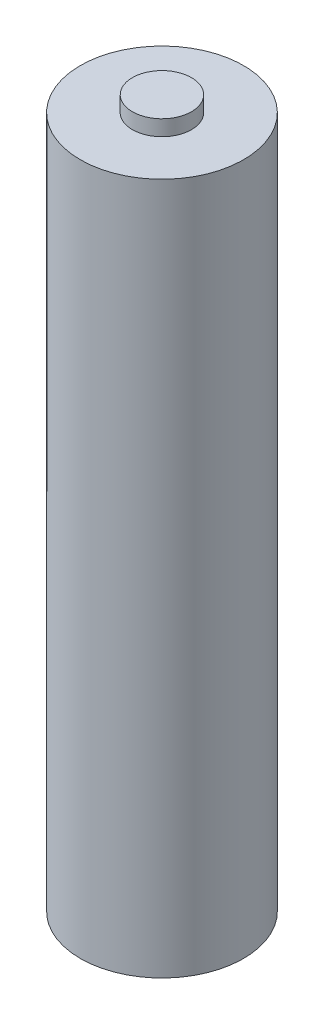
ISO-10303-21;
HEADER;
FILE_DESCRIPTION(('STEP AP214'),'2;1');
FILE_NAME('part.step','',(''),(''),'','','');
FILE_SCHEMA(('AUTOMOTIVE_DESIGN { 1 0 10303 214 1 1 1 1 }'));
ENDSEC;
DATA;
#1=APPLICATION_CONTEXT('core data for automotive mechanical design processes');
#2=APPLICATION_PROTOCOL_DEFINITION('international standard','automotive_design',2000,#1);
#3=PRODUCT_CONTEXT('',#1,'mechanical');
#4=PRODUCT('Part','Part','',(#3));
#5=PRODUCT_RELATED_PRODUCT_CATEGORY('part','',(#4));
#6=PRODUCT_DEFINITION_FORMATION('','',#4);
#7=PRODUCT_DEFINITION_CONTEXT('part definition',#1,'design');
#8=PRODUCT_DEFINITION('design','',#6,#7);
#9=PRODUCT_DEFINITION_SHAPE('','',#8);
#10=(LENGTH_UNIT() NAMED_UNIT(*) SI_UNIT(.MILLI.,.METRE.));
#11=(NAMED_UNIT(*) PLANE_ANGLE_UNIT() SI_UNIT($,.RADIAN.));
#12=(NAMED_UNIT(*) SI_UNIT($,.STERADIAN.) SOLID_ANGLE_UNIT());
#13=UNCERTAINTY_MEASURE_WITH_UNIT(LENGTH_MEASURE(1.E-05),#10,'distance_accuracy_value','');
#14=(GEOMETRIC_REPRESENTATION_CONTEXT(3) GLOBAL_UNCERTAINTY_ASSIGNED_CONTEXT((#13)) GLOBAL_UNIT_ASSIGNED_CONTEXT((#10,
#11,#12)) REPRESENTATION_CONTEXT('',''));
#15=CARTESIAN_POINT('',(0.,0.,0.));
#16=DIRECTION('',(0.,0.,1.));
#17=DIRECTION('',(1.,0.,0.));
#18=AXIS2_PLACEMENT_3D('',#15,#16,#17);
#19=CARTESIAN_POINT('',(0.,44.5,0.));
#20=DIRECTION('',(0.,-1.,0.));
#21=DIRECTION('',(0.,0.,-1.));
#22=AXIS2_PLACEMENT_3D('',#19,#20,#21);
#23=CYLINDRICAL_SURFACE('',#22,5.25);
#24=CARTESIAN_POINT('',(0.,44.5,0.));
#25=DIRECTION('',(0.,1.,0.));
#26=DIRECTION('',(0.,0.,1.));
#27=AXIS2_PLACEMENT_3D('',#24,#25,#26);
#28=CIRCLE('',#27,5.25);
#29=CARTESIAN_POINT('',(0.,44.5,5.25));
#30=VERTEX_POINT('',#29);
#31=EDGE_CURVE('E41',#30,#30,#28,.T.);
#32=ORIENTED_EDGE('',*,*,#31,.F.);
#33=EDGE_LOOP('',(#32));
#34=FACE_BOUND('',#33,.T.);
#35=CARTESIAN_POINT('',(0.,0.,0.));
#36=DIRECTION('',(0.,1.,0.));
#37=DIRECTION('',(0.,0.,1.));
#38=AXIS2_PLACEMENT_3D('',#35,#36,#37);
#39=CIRCLE('',#38,5.25);
#40=CARTESIAN_POINT('',(0.,0.,5.25));
#41=VERTEX_POINT('',#40);
#42=EDGE_CURVE('E37',#41,#41,#39,.T.);
#43=ORIENTED_EDGE('',*,*,#42,.T.);
#44=EDGE_LOOP('',(#43));
#45=FACE_BOUND('',#44,.T.);
#46=ADVANCED_FACE('F34',(#34,#45),#23,.T.);
#47=CARTESIAN_POINT('',(0.,44.5,0.));
#48=DIRECTION('',(0.,1.,0.));
#49=DIRECTION('',(0.,0.,1.));
#50=AXIS2_PLACEMENT_3D('',#47,#48,#49);
#51=PLANE('',#50);
#52=CARTESIAN_POINT('',(0.,44.5,0.));
#53=DIRECTION('',(0.,1.,0.));
#54=DIRECTION('',(0.,0.,1.));
#55=AXIS2_PLACEMENT_3D('',#52,#53,#54);
#56=CIRCLE('',#55,1.9);
#57=CARTESIAN_POINT('',(0.,44.5,1.9));
#58=VERTEX_POINT('',#57);
#59=EDGE_CURVE('E10',#58,#58,#56,.T.);
#60=ORIENTED_EDGE('',*,*,#59,.F.);
#61=EDGE_LOOP('',(#60));
#62=FACE_BOUND('',#61,.T.);
#63=ORIENTED_EDGE('',*,*,#31,.T.);
#64=EDGE_LOOP('',(#63));
#65=FACE_BOUND('',#64,.T.);
#66=ADVANCED_FACE('F58',(#62,#65),#51,.T.);
#67=CARTESIAN_POINT('',(0.,0.,0.));
#68=DIRECTION('',(0.,1.,0.));
#69=DIRECTION('',(0.,0.,1.));
#70=AXIS2_PLACEMENT_3D('',#67,#68,#69);
#71=PLANE('',#70);
#72=ORIENTED_EDGE('',*,*,#42,.F.);
#73=EDGE_LOOP('',(#72));
#74=FACE_BOUND('',#73,.T.);
#75=ADVANCED_FACE('F55',(#74),#71,.F.);
#76=CARTESIAN_POINT('',(0.,45.5,0.));
#77=DIRECTION('',(0.,-1.,0.));
#78=DIRECTION('',(0.,0.,-1.));
#79=AXIS2_PLACEMENT_3D('',#76,#77,#78);
#80=CYLINDRICAL_SURFACE('',#79,1.9);
#81=CARTESIAN_POINT('',(0.,45.5,0.));
#82=DIRECTION('',(0.,1.,0.));
#83=DIRECTION('',(0.,0.,1.));
#84=AXIS2_PLACEMENT_3D('',#81,#82,#83);
#85=CIRCLE('',#84,1.9);
#86=CARTESIAN_POINT('',(0.,45.5,1.9));
#87=VERTEX_POINT('',#86);
#88=EDGE_CURVE('E47',#87,#87,#85,.T.);
#89=ORIENTED_EDGE('',*,*,#88,.F.);
#90=EDGE_LOOP('',(#89));
#91=FACE_BOUND('',#90,.T.);
#92=ORIENTED_EDGE('',*,*,#59,.T.);
#93=EDGE_LOOP('',(#92));
#94=FACE_BOUND('',#93,.T.);
#95=ADVANCED_FACE('F57',(#91,#94),#80,.T.);
#96=CARTESIAN_POINT('',(0.,45.5,0.));
#97=DIRECTION('',(0.,1.,0.));
#98=DIRECTION('',(0.,0.,1.));
#99=AXIS2_PLACEMENT_3D('',#96,#97,#98);
#100=PLANE('',#99);
#101=ORIENTED_EDGE('',*,*,#88,.T.);
#102=EDGE_LOOP('',(#101));
#103=FACE_BOUND('',#102,.T.);
#104=ADVANCED_FACE('F63',(#103),#100,.T.);
#105=CLOSED_SHELL('',(#46,#66,#75,#95,#104));
#106=MANIFOLD_SOLID_BREP('B2',#105);
#107=ADVANCED_BREP_SHAPE_REPRESENTATION('',(#18,#106),#14);
#108=SHAPE_DEFINITION_REPRESENTATION(#9,#107);
ENDSEC;
END-ISO-10303-21;
